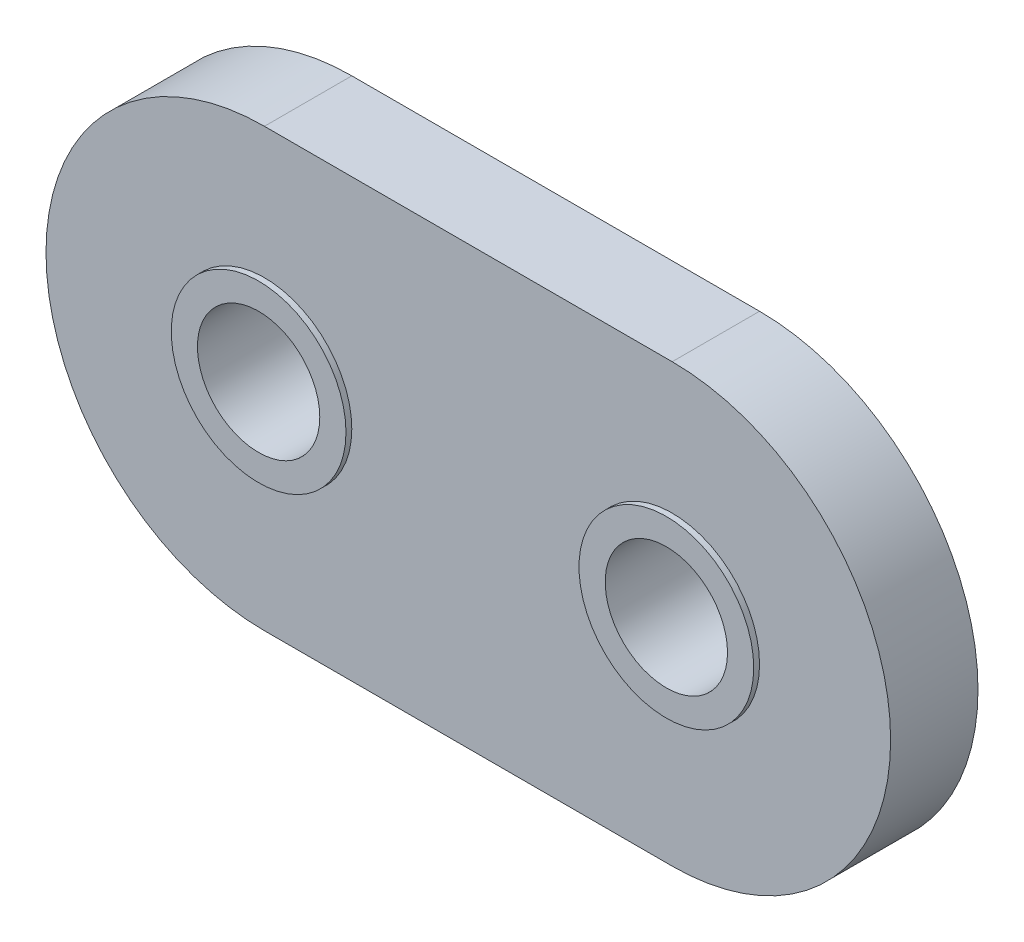
ISO-10303-21;
HEADER;
FILE_DESCRIPTION(('STEP AP214'),'2;1');
FILE_NAME('part.step','',(''),(''),'','','');
FILE_SCHEMA(('AUTOMOTIVE_DESIGN { 1 0 10303 214 1 1 1 1 }'));
ENDSEC;
DATA;
#1=APPLICATION_CONTEXT('core data for automotive mechanical design processes');
#2=APPLICATION_PROTOCOL_DEFINITION('international standard','automotive_design',2000,#1);
#3=PRODUCT_CONTEXT('',#1,'mechanical');
#4=PRODUCT('Part','Part','',(#3));
#5=PRODUCT_RELATED_PRODUCT_CATEGORY('part','',(#4));
#6=PRODUCT_DEFINITION_FORMATION('','',#4);
#7=PRODUCT_DEFINITION_CONTEXT('part definition',#1,'design');
#8=PRODUCT_DEFINITION('design','',#6,#7);
#9=PRODUCT_DEFINITION_SHAPE('','',#8);
#10=(LENGTH_UNIT() NAMED_UNIT(*) SI_UNIT(.MILLI.,.METRE.));
#11=(NAMED_UNIT(*) PLANE_ANGLE_UNIT() SI_UNIT($,.RADIAN.));
#12=(NAMED_UNIT(*) SI_UNIT($,.STERADIAN.) SOLID_ANGLE_UNIT());
#13=UNCERTAINTY_MEASURE_WITH_UNIT(LENGTH_MEASURE(1.E-05),#10,'distance_accuracy_value','');
#14=(GEOMETRIC_REPRESENTATION_CONTEXT(3) GLOBAL_UNCERTAINTY_ASSIGNED_CONTEXT((#13)) GLOBAL_UNIT_ASSIGNED_CONTEXT((#10,
#11,#12)) REPRESENTATION_CONTEXT('',''));
#15=CARTESIAN_POINT('',(0.,0.,0.));
#16=DIRECTION('',(0.,0.,1.));
#17=DIRECTION('',(1.,0.,0.));
#18=AXIS2_PLACEMENT_3D('',#15,#16,#17);
#19=CARTESIAN_POINT('',(0.,0.,3.));
#20=DIRECTION('',(0.,0.,1.));
#21=DIRECTION('',(1.,0.,0.));
#22=AXIS2_PLACEMENT_3D('',#19,#20,#21);
#23=PLANE('',#22);
#24=CARTESIAN_POINT('',(0.,0.,3.));
#25=DIRECTION('',(0.,0.,1.));
#26=DIRECTION('',(1.,0.,0.));
#27=AXIS2_PLACEMENT_3D('',#24,#25,#26);
#28=CIRCLE('',#27,3.);
#29=CARTESIAN_POINT('',(3.,0.,3.));
#30=VERTEX_POINT('',#29);
#31=EDGE_CURVE('E120',#30,#30,#28,.T.);
#32=ORIENTED_EDGE('',*,*,#31,.F.);
#33=EDGE_LOOP('',(#32));
#34=FACE_BOUND('',#33,.T.);
#35=CARTESIAN_POINT('',(0.,0.,3.));
#36=DIRECTION('',(0.,0.,1.));
#37=DIRECTION('',(1.,0.,0.));
#38=AXIS2_PLACEMENT_3D('',#35,#36,#37);
#39=CIRCLE('',#38,7.5);
#40=CARTESIAN_POINT('',(0.,7.5,3.));
#41=VERTEX_POINT('',#40);
#42=CARTESIAN_POINT('',(0.,-7.5,3.));
#43=VERTEX_POINT('',#42);
#44=EDGE_CURVE('E87',#41,#43,#39,.T.);
#45=ORIENTED_EDGE('',*,*,#44,.T.);
#46=DIRECTION('',(1.,0.,0.));
#47=VECTOR('',#46,1.);
#48=CARTESIAN_POINT('',(0.,-7.5,3.));
#49=LINE('',#48,#47);
#50=CARTESIAN_POINT('',(14.,-7.5,3.));
#51=VERTEX_POINT('',#50);
#52=EDGE_CURVE('E82',#43,#51,#49,.T.);
#53=ORIENTED_EDGE('',*,*,#52,.T.);
#54=CARTESIAN_POINT('',(14.,0.,3.));
#55=DIRECTION('',(0.,0.,1.));
#56=DIRECTION('',(1.,0.,0.));
#57=AXIS2_PLACEMENT_3D('',#54,#55,#56);
#58=CIRCLE('',#57,7.5);
#59=CARTESIAN_POINT('',(14.,7.5,3.));
#60=VERTEX_POINT('',#59);
#61=EDGE_CURVE('E85',#51,#60,#58,.T.);
#62=ORIENTED_EDGE('',*,*,#61,.T.);
#63=DIRECTION('',(-1.,0.,0.));
#64=VECTOR('',#63,1.);
#65=CARTESIAN_POINT('',(0.,7.5,3.));
#66=LINE('',#65,#64);
#67=EDGE_CURVE('E52',#60,#41,#66,.T.);
#68=ORIENTED_EDGE('',*,*,#67,.T.);
#69=EDGE_LOOP('',(#45,#53,#62,#68));
#70=FACE_BOUND('',#69,.T.);
#71=CARTESIAN_POINT('',(14.,0.,3.));
#72=DIRECTION('',(0.,0.,1.));
#73=DIRECTION('',(1.,0.,0.));
#74=AXIS2_PLACEMENT_3D('',#71,#72,#73);
#75=CIRCLE('',#74,3.);
#76=CARTESIAN_POINT('',(17.,0.,3.));
#77=VERTEX_POINT('',#76);
#78=EDGE_CURVE('E129',#77,#77,#75,.T.);
#79=ORIENTED_EDGE('',*,*,#78,.F.);
#80=EDGE_LOOP('',(#79));
#81=FACE_BOUND('',#80,.T.);
#82=ADVANCED_FACE('F35',(#34,#70,#81),#23,.T.);
#83=CARTESIAN_POINT('',(0.,0.,0.));
#84=DIRECTION('',(0.,0.,1.));
#85=DIRECTION('',(1.,0.,0.));
#86=AXIS2_PLACEMENT_3D('',#83,#84,#85);
#87=PLANE('',#86);
#88=CARTESIAN_POINT('',(0.,0.,0.));
#89=DIRECTION('',(0.,0.,1.));
#90=DIRECTION('',(1.,0.,0.));
#91=AXIS2_PLACEMENT_3D('',#88,#89,#90);
#92=CIRCLE('',#91,7.5);
#93=CARTESIAN_POINT('',(0.,7.5,0.));
#94=VERTEX_POINT('',#93);
#95=CARTESIAN_POINT('',(0.,-7.5,0.));
#96=VERTEX_POINT('',#95);
#97=EDGE_CURVE('E99',#94,#96,#92,.T.);
#98=ORIENTED_EDGE('',*,*,#97,.F.);
#99=DIRECTION('',(-1.,0.,0.));
#100=VECTOR('',#99,1.);
#101=CARTESIAN_POINT('',(0.,7.5,0.));
#102=LINE('',#101,#100);
#103=CARTESIAN_POINT('',(14.,7.5,0.));
#104=VERTEX_POINT('',#103);
#105=EDGE_CURVE('E75',#104,#94,#102,.T.);
#106=ORIENTED_EDGE('',*,*,#105,.F.);
#107=CARTESIAN_POINT('',(14.,0.,0.));
#108=DIRECTION('',(0.,0.,1.));
#109=DIRECTION('',(1.,0.,0.));
#110=AXIS2_PLACEMENT_3D('',#107,#108,#109);
#111=CIRCLE('',#110,7.5);
#112=CARTESIAN_POINT('',(14.,-7.5,0.));
#113=VERTEX_POINT('',#112);
#114=EDGE_CURVE('E69',#113,#104,#111,.T.);
#115=ORIENTED_EDGE('',*,*,#114,.F.);
#116=DIRECTION('',(1.,0.,0.));
#117=VECTOR('',#116,1.);
#118=CARTESIAN_POINT('',(0.,-7.5,0.));
#119=LINE('',#118,#117);
#120=EDGE_CURVE('E91',#96,#113,#119,.T.);
#121=ORIENTED_EDGE('',*,*,#120,.F.);
#122=EDGE_LOOP('',(#98,#106,#115,#121));
#123=FACE_BOUND('',#122,.T.);
#124=CARTESIAN_POINT('',(0.,0.,0.));
#125=DIRECTION('',(0.,0.,1.));
#126=DIRECTION('',(1.,0.,0.));
#127=AXIS2_PLACEMENT_3D('',#124,#125,#126);
#128=CIRCLE('',#127,2.1);
#129=CARTESIAN_POINT('',(2.1,0.,0.));
#130=VERTEX_POINT('',#129);
#131=EDGE_CURVE('E102',#130,#130,#128,.T.);
#132=ORIENTED_EDGE('',*,*,#131,.T.);
#133=EDGE_LOOP('',(#132));
#134=FACE_BOUND('',#133,.T.);
#135=CARTESIAN_POINT('',(14.,0.,0.));
#136=DIRECTION('',(0.,0.,1.));
#137=DIRECTION('',(1.,0.,0.));
#138=AXIS2_PLACEMENT_3D('',#135,#136,#137);
#139=CIRCLE('',#138,2.1);
#140=CARTESIAN_POINT('',(16.1,0.,0.));
#141=VERTEX_POINT('',#140);
#142=EDGE_CURVE('E116',#141,#141,#139,.T.);
#143=ORIENTED_EDGE('',*,*,#142,.T.);
#144=EDGE_LOOP('',(#143));
#145=FACE_BOUND('',#144,.T.);
#146=ADVANCED_FACE('F110',(#123,#134,#145),#87,.F.);
#147=CARTESIAN_POINT('',(0.,0.,3.));
#148=DIRECTION('',(0.,0.,-1.));
#149=DIRECTION('',(-1.,0.,0.));
#150=AXIS2_PLACEMENT_3D('',#147,#148,#149);
#151=CYLINDRICAL_SURFACE('',#150,7.5);
#152=ORIENTED_EDGE('',*,*,#97,.T.);
#153=DIRECTION('',(0.,0.,-1.));
#154=VECTOR('',#153,1.);
#155=CARTESIAN_POINT('',(0.,-7.5,3.));
#156=LINE('',#155,#154);
#157=EDGE_CURVE('E11',#43,#96,#156,.T.);
#158=ORIENTED_EDGE('',*,*,#157,.F.);
#159=ORIENTED_EDGE('',*,*,#44,.F.);
#160=DIRECTION('',(0.,0.,-1.));
#161=VECTOR('',#160,1.);
#162=CARTESIAN_POINT('',(0.,7.5,3.));
#163=LINE('',#162,#161);
#164=EDGE_CURVE('E95',#41,#94,#163,.T.);
#165=ORIENTED_EDGE('',*,*,#164,.T.);
#166=EDGE_LOOP('',(#152,#158,#159,#165));
#167=FACE_BOUND('',#166,.T.);
#168=ADVANCED_FACE('F37',(#167),#151,.T.);
#169=CARTESIAN_POINT('',(0.,-7.5,3.));
#170=DIRECTION('',(0.,1.,0.));
#171=DIRECTION('',(-1.,0.,0.));
#172=AXIS2_PLACEMENT_3D('',#169,#170,#171);
#173=PLANE('',#172);
#174=ORIENTED_EDGE('',*,*,#120,.T.);
#175=DIRECTION('',(0.,0.,-1.));
#176=VECTOR('',#175,1.);
#177=CARTESIAN_POINT('',(14.,-7.5,3.));
#178=LINE('',#177,#176);
#179=EDGE_CURVE('E44',#51,#113,#178,.T.);
#180=ORIENTED_EDGE('',*,*,#179,.F.);
#181=ORIENTED_EDGE('',*,*,#52,.F.);
#182=ORIENTED_EDGE('',*,*,#157,.T.);
#183=EDGE_LOOP('',(#174,#180,#181,#182));
#184=FACE_BOUND('',#183,.T.);
#185=ADVANCED_FACE('F90',(#184),#173,.F.);
#186=CARTESIAN_POINT('',(14.,0.,3.));
#187=DIRECTION('',(0.,0.,-1.));
#188=DIRECTION('',(-1.,0.,0.));
#189=AXIS2_PLACEMENT_3D('',#186,#187,#188);
#190=CYLINDRICAL_SURFACE('',#189,7.5);
#191=ORIENTED_EDGE('',*,*,#114,.T.);
#192=DIRECTION('',(0.,0.,-1.));
#193=VECTOR('',#192,1.);
#194=CARTESIAN_POINT('',(14.,7.5,3.));
#195=LINE('',#194,#193);
#196=EDGE_CURVE('E92',#60,#104,#195,.T.);
#197=ORIENTED_EDGE('',*,*,#196,.F.);
#198=ORIENTED_EDGE('',*,*,#61,.F.);
#199=ORIENTED_EDGE('',*,*,#179,.T.);
#200=EDGE_LOOP('',(#191,#197,#198,#199));
#201=FACE_BOUND('',#200,.T.);
#202=ADVANCED_FACE('F93',(#201),#190,.T.);
#203=CARTESIAN_POINT('',(0.,7.5,3.));
#204=DIRECTION('',(0.,-1.,0.));
#205=DIRECTION('',(1.,0.,0.));
#206=AXIS2_PLACEMENT_3D('',#203,#204,#205);
#207=PLANE('',#206);
#208=ORIENTED_EDGE('',*,*,#105,.T.);
#209=ORIENTED_EDGE('',*,*,#164,.F.);
#210=ORIENTED_EDGE('',*,*,#67,.F.);
#211=ORIENTED_EDGE('',*,*,#196,.T.);
#212=EDGE_LOOP('',(#208,#209,#210,#211));
#213=FACE_BOUND('',#212,.T.);
#214=ADVANCED_FACE('F107',(#213),#207,.F.);
#215=CARTESIAN_POINT('',(0.,0.,3.));
#216=DIRECTION('',(0.,0.,-1.));
#217=DIRECTION('',(-1.,0.,0.));
#218=AXIS2_PLACEMENT_3D('',#215,#216,#217);
#219=CYLINDRICAL_SURFACE('',#218,2.1);
#220=ORIENTED_EDGE('',*,*,#131,.F.);
#221=EDGE_LOOP('',(#220));
#222=FACE_BOUND('',#221,.T.);
#223=CARTESIAN_POINT('',(0.,0.,3.2));
#224=DIRECTION('',(0.,0.,1.));
#225=DIRECTION('',(1.,0.,0.));
#226=AXIS2_PLACEMENT_3D('',#223,#224,#225);
#227=CIRCLE('',#226,2.1);
#228=CARTESIAN_POINT('',(2.1,0.,3.2));
#229=VERTEX_POINT('',#228);
#230=EDGE_CURVE('E123',#229,#229,#227,.T.);
#231=ORIENTED_EDGE('',*,*,#230,.T.);
#232=EDGE_LOOP('',(#231));
#233=FACE_BOUND('',#232,.T.);
#234=ADVANCED_FACE('F164',(#222,#233),#219,.F.);
#235=CARTESIAN_POINT('',(14.,0.,3.));
#236=DIRECTION('',(0.,0.,-1.));
#237=DIRECTION('',(-1.,0.,0.));
#238=AXIS2_PLACEMENT_3D('',#235,#236,#237);
#239=CYLINDRICAL_SURFACE('',#238,2.1);
#240=ORIENTED_EDGE('',*,*,#142,.F.);
#241=EDGE_LOOP('',(#240));
#242=FACE_BOUND('',#241,.T.);
#243=CARTESIAN_POINT('',(14.,0.,3.2));
#244=DIRECTION('',(0.,0.,1.));
#245=DIRECTION('',(1.,0.,0.));
#246=AXIS2_PLACEMENT_3D('',#243,#244,#245);
#247=CIRCLE('',#246,2.1);
#248=CARTESIAN_POINT('',(16.1,0.,3.2));
#249=VERTEX_POINT('',#248);
#250=EDGE_CURVE('E132',#249,#249,#247,.T.);
#251=ORIENTED_EDGE('',*,*,#250,.T.);
#252=EDGE_LOOP('',(#251));
#253=FACE_BOUND('',#252,.T.);
#254=ADVANCED_FACE('F138',(#242,#253),#239,.F.);
#255=CARTESIAN_POINT('',(0.,0.,3.2));
#256=DIRECTION('',(0.,0.,1.));
#257=DIRECTION('',(1.,0.,0.));
#258=AXIS2_PLACEMENT_3D('',#255,#256,#257);
#259=PLANE('',#258);
#260=CARTESIAN_POINT('',(0.,0.,3.2));
#261=DIRECTION('',(0.,0.,1.));
#262=DIRECTION('',(1.,0.,0.));
#263=AXIS2_PLACEMENT_3D('',#260,#261,#262);
#264=CIRCLE('',#263,3.);
#265=CARTESIAN_POINT('',(3.,0.,3.2));
#266=VERTEX_POINT('',#265);
#267=EDGE_CURVE('E119',#266,#266,#264,.T.);
#268=ORIENTED_EDGE('',*,*,#267,.T.);
#269=EDGE_LOOP('',(#268));
#270=FACE_BOUND('',#269,.T.);
#271=ORIENTED_EDGE('',*,*,#230,.F.);
#272=EDGE_LOOP('',(#271));
#273=FACE_BOUND('',#272,.T.);
#274=ADVANCED_FACE('F152',(#270,#273),#259,.T.);
#275=CARTESIAN_POINT('',(0.,0.,3.2));
#276=DIRECTION('',(0.,0.,-1.));
#277=DIRECTION('',(-1.,0.,0.));
#278=AXIS2_PLACEMENT_3D('',#275,#276,#277);
#279=CYLINDRICAL_SURFACE('',#278,3.);
#280=ORIENTED_EDGE('',*,*,#267,.F.);
#281=EDGE_LOOP('',(#280));
#282=FACE_BOUND('',#281,.T.);
#283=ORIENTED_EDGE('',*,*,#31,.T.);
#284=EDGE_LOOP('',(#283));
#285=FACE_BOUND('',#284,.T.);
#286=ADVANCED_FACE('F143',(#282,#285),#279,.T.);
#287=CARTESIAN_POINT('',(14.,0.,3.2));
#288=DIRECTION('',(0.,0.,1.));
#289=DIRECTION('',(1.,0.,0.));
#290=AXIS2_PLACEMENT_3D('',#287,#288,#289);
#291=PLANE('',#290);
#292=CARTESIAN_POINT('',(14.,0.,3.2));
#293=DIRECTION('',(0.,0.,1.));
#294=DIRECTION('',(1.,0.,0.));
#295=AXIS2_PLACEMENT_3D('',#292,#293,#294);
#296=CIRCLE('',#295,3.);
#297=CARTESIAN_POINT('',(17.,0.,3.2));
#298=VERTEX_POINT('',#297);
#299=EDGE_CURVE('E128',#298,#298,#296,.T.);
#300=ORIENTED_EDGE('',*,*,#299,.T.);
#301=EDGE_LOOP('',(#300));
#302=FACE_BOUND('',#301,.T.);
#303=ORIENTED_EDGE('',*,*,#250,.F.);
#304=EDGE_LOOP('',(#303));
#305=FACE_BOUND('',#304,.T.);
#306=ADVANCED_FACE('F140',(#302,#305),#291,.T.);
#307=CARTESIAN_POINT('',(14.,0.,3.2));
#308=DIRECTION('',(0.,0.,-1.));
#309=DIRECTION('',(-1.,0.,0.));
#310=AXIS2_PLACEMENT_3D('',#307,#308,#309);
#311=CYLINDRICAL_SURFACE('',#310,3.);
#312=ORIENTED_EDGE('',*,*,#299,.F.);
#313=EDGE_LOOP('',(#312));
#314=FACE_BOUND('',#313,.T.);
#315=ORIENTED_EDGE('',*,*,#78,.T.);
#316=EDGE_LOOP('',(#315));
#317=FACE_BOUND('',#316,.T.);
#318=ADVANCED_FACE('F142',(#314,#317),#311,.T.);
#319=CLOSED_SHELL('',(#82,#146,#168,#185,#202,#214,#234,#254,#274,#286,#306,#318));
#320=MANIFOLD_SOLID_BREP('B2',#319);
#321=ADVANCED_BREP_SHAPE_REPRESENTATION('',(#18,#320),#14);
#322=SHAPE_DEFINITION_REPRESENTATION(#9,#321);
ENDSEC;
END-ISO-10303-21;
